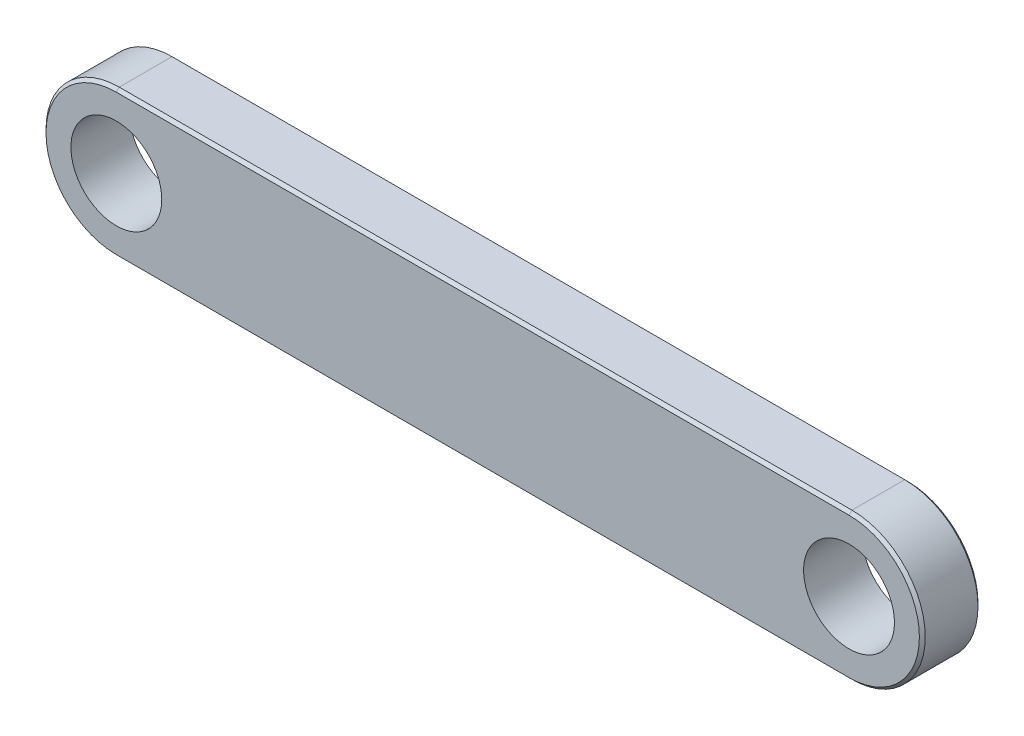
ISO-10303-21;
HEADER;
FILE_DESCRIPTION(('STEP AP214'),'2;1');
FILE_NAME('part.step','',(''),(''),'','','');
FILE_SCHEMA(('AUTOMOTIVE_DESIGN { 1 0 10303 214 1 1 1 1 }'));
ENDSEC;
DATA;
#1=APPLICATION_CONTEXT('core data for automotive mechanical design processes');
#2=APPLICATION_PROTOCOL_DEFINITION('international standard','automotive_design',2000,#1);
#3=PRODUCT_CONTEXT('',#1,'mechanical');
#4=PRODUCT('Part','Part','',(#3));
#5=PRODUCT_RELATED_PRODUCT_CATEGORY('part','',(#4));
#6=PRODUCT_DEFINITION_FORMATION('','',#4);
#7=PRODUCT_DEFINITION_CONTEXT('part definition',#1,'design');
#8=PRODUCT_DEFINITION('design','',#6,#7);
#9=PRODUCT_DEFINITION_SHAPE('','',#8);
#10=(LENGTH_UNIT() NAMED_UNIT(*) SI_UNIT(.MILLI.,.METRE.));
#11=(NAMED_UNIT(*) PLANE_ANGLE_UNIT() SI_UNIT($,.RADIAN.));
#12=(NAMED_UNIT(*) SI_UNIT($,.STERADIAN.) SOLID_ANGLE_UNIT());
#13=UNCERTAINTY_MEASURE_WITH_UNIT(LENGTH_MEASURE(1.E-05),#10,'distance_accuracy_value','');
#14=(GEOMETRIC_REPRESENTATION_CONTEXT(3) GLOBAL_UNCERTAINTY_ASSIGNED_CONTEXT((#13)) GLOBAL_UNIT_ASSIGNED_CONTEXT((#10,
#11,#12)) REPRESENTATION_CONTEXT('',''));
#15=CARTESIAN_POINT('',(0.,0.,0.));
#16=DIRECTION('',(0.,0.,1.));
#17=DIRECTION('',(1.,0.,0.));
#18=AXIS2_PLACEMENT_3D('',#15,#16,#17);
#19=CARTESIAN_POINT('',(-12.5,0.,2.));
#20=DIRECTION('',(0.,0.,1.));
#21=DIRECTION('',(1.,0.,0.));
#22=AXIS2_PLACEMENT_3D('',#19,#20,#21);
#23=PLANE('',#22);
#24=CARTESIAN_POINT('',(-12.5,0.,2.));
#25=DIRECTION('',(0.,0.,1.));
#26=DIRECTION('',(1.,0.,0.));
#27=AXIS2_PLACEMENT_3D('',#24,#25,#26);
#28=CIRCLE('',#27,2.4);
#29=CARTESIAN_POINT('',(-12.5,2.4,2.));
#30=VERTEX_POINT('',#29);
#31=CARTESIAN_POINT('',(-12.5,-2.4,2.));
#32=VERTEX_POINT('',#31);
#33=EDGE_CURVE('E45',#30,#32,#28,.T.);
#34=ORIENTED_EDGE('',*,*,#33,.T.);
#35=DIRECTION('',(1.,0.,0.));
#36=VECTOR('',#35,1.);
#37=CARTESIAN_POINT('',(12.5,-2.4,2.));
#38=LINE('',#37,#36);
#39=CARTESIAN_POINT('',(12.5,-2.4,2.));
#40=VERTEX_POINT('',#39);
#41=EDGE_CURVE('E11',#32,#40,#38,.T.);
#42=ORIENTED_EDGE('',*,*,#41,.T.);
#43=CARTESIAN_POINT('',(12.5,0.,2.));
#44=DIRECTION('',(0.,0.,1.));
#45=DIRECTION('',(1.,0.,0.));
#46=AXIS2_PLACEMENT_3D('',#43,#44,#45);
#47=CIRCLE('',#46,2.4);
#48=CARTESIAN_POINT('',(12.5,2.40000000000001,2.));
#49=VERTEX_POINT('',#48);
#50=EDGE_CURVE('E162',#40,#49,#47,.T.);
#51=ORIENTED_EDGE('',*,*,#50,.T.);
#52=DIRECTION('',(-1.,0.,0.));
#53=VECTOR('',#52,1.);
#54=CARTESIAN_POINT('',(-12.5,2.4,2.));
#55=LINE('',#54,#53);
#56=EDGE_CURVE('E132',#49,#30,#55,.T.);
#57=ORIENTED_EDGE('',*,*,#56,.T.);
#58=EDGE_LOOP('',(#34,#42,#51,#57));
#59=FACE_BOUND('',#58,.T.);
#60=CARTESIAN_POINT('',(-12.5,0.,2.));
#61=DIRECTION('',(0.,0.,1.));
#62=DIRECTION('',(1.,0.,0.));
#63=AXIS2_PLACEMENT_3D('',#60,#61,#62);
#64=CIRCLE('',#63,1.55);
#65=CARTESIAN_POINT('',(-10.95,0.,2.));
#66=VERTEX_POINT('',#65);
#67=EDGE_CURVE('E210',#66,#66,#64,.T.);
#68=ORIENTED_EDGE('',*,*,#67,.F.);
#69=EDGE_LOOP('',(#68));
#70=FACE_BOUND('',#69,.T.);
#71=CARTESIAN_POINT('',(12.5,0.,2.));
#72=DIRECTION('',(0.,0.,1.));
#73=DIRECTION('',(1.,0.,0.));
#74=AXIS2_PLACEMENT_3D('',#71,#72,#73);
#75=CIRCLE('',#74,1.55);
#76=CARTESIAN_POINT('',(14.05,0.,2.));
#77=VERTEX_POINT('',#76);
#78=EDGE_CURVE('E214',#77,#77,#75,.T.);
#79=ORIENTED_EDGE('',*,*,#78,.F.);
#80=EDGE_LOOP('',(#79));
#81=FACE_BOUND('',#80,.T.);
#82=ADVANCED_FACE('F35',(#59,#70,#81),#23,.T.);
#83=CARTESIAN_POINT('',(-12.5,0.,0.));
#84=DIRECTION('',(0.,0.,1.));
#85=DIRECTION('',(1.,0.,0.));
#86=AXIS2_PLACEMENT_3D('',#83,#84,#85);
#87=PLANE('',#86);
#88=DIRECTION('',(1.,0.,0.));
#89=VECTOR('',#88,1.);
#90=CARTESIAN_POINT('',(-12.5,2.4,0.));
#91=LINE('',#90,#89);
#92=CARTESIAN_POINT('',(-12.5,2.4,0.));
#93=VERTEX_POINT('',#92);
#94=CARTESIAN_POINT('',(12.5,2.40000000000001,0.));
#95=VERTEX_POINT('',#94);
#96=EDGE_CURVE('E138',#93,#95,#91,.T.);
#97=ORIENTED_EDGE('',*,*,#96,.T.);
#98=CARTESIAN_POINT('',(12.5,0.,0.));
#99=DIRECTION('',(0.,0.,1.));
#100=DIRECTION('',(1.,0.,0.));
#101=AXIS2_PLACEMENT_3D('',#98,#99,#100);
#102=CIRCLE('',#101,2.4);
#103=CARTESIAN_POINT('',(12.5,-2.4,0.));
#104=VERTEX_POINT('',#103);
#105=EDGE_CURVE('E149',#95,#104,#102,.F.);
#106=ORIENTED_EDGE('',*,*,#105,.T.);
#107=DIRECTION('',(-1.,0.,0.));
#108=VECTOR('',#107,1.);
#109=CARTESIAN_POINT('',(-12.5,-2.4,0.));
#110=LINE('',#109,#108);
#111=CARTESIAN_POINT('',(-12.5,-2.4,0.));
#112=VERTEX_POINT('',#111);
#113=EDGE_CURVE('E147',#104,#112,#110,.T.);
#114=ORIENTED_EDGE('',*,*,#113,.T.);
#115=CARTESIAN_POINT('',(-12.5,0.,0.));
#116=DIRECTION('',(0.,0.,1.));
#117=DIRECTION('',(1.,0.,0.));
#118=AXIS2_PLACEMENT_3D('',#115,#116,#117);
#119=CIRCLE('',#118,2.4);
#120=EDGE_CURVE('E145',#112,#93,#119,.F.);
#121=ORIENTED_EDGE('',*,*,#120,.T.);
#122=EDGE_LOOP('',(#97,#106,#114,#121));
#123=FACE_BOUND('',#122,.T.);
#124=CARTESIAN_POINT('',(-12.5,0.,0.));
#125=DIRECTION('',(0.,0.,1.));
#126=DIRECTION('',(1.,0.,0.));
#127=AXIS2_PLACEMENT_3D('',#124,#125,#126);
#128=CIRCLE('',#127,1.55);
#129=CARTESIAN_POINT('',(-10.95,0.,0.));
#130=VERTEX_POINT('',#129);
#131=EDGE_CURVE('E211',#130,#130,#128,.T.);
#132=ORIENTED_EDGE('',*,*,#131,.T.);
#133=EDGE_LOOP('',(#132));
#134=FACE_BOUND('',#133,.T.);
#135=CARTESIAN_POINT('',(12.5,0.,0.));
#136=DIRECTION('',(0.,0.,1.));
#137=DIRECTION('',(1.,0.,0.));
#138=AXIS2_PLACEMENT_3D('',#135,#136,#137);
#139=CIRCLE('',#138,1.55);
#140=CARTESIAN_POINT('',(14.05,0.,0.));
#141=VERTEX_POINT('',#140);
#142=EDGE_CURVE('E175',#141,#141,#139,.T.);
#143=ORIENTED_EDGE('',*,*,#142,.T.);
#144=EDGE_LOOP('',(#143));
#145=FACE_BOUND('',#144,.T.);
#146=ADVANCED_FACE('F200',(#123,#134,#145),#87,.F.);
#147=CARTESIAN_POINT('',(-12.5,0.,2.));
#148=DIRECTION('',(0.,0.,-1.));
#149=DIRECTION('',(-1.,0.,0.));
#150=AXIS2_PLACEMENT_3D('',#147,#148,#149);
#151=CYLINDRICAL_SURFACE('',#150,2.5);
#152=DIRECTION('',(0.,0.,-1.));
#153=VECTOR('',#152,1.);
#154=CARTESIAN_POINT('',(-12.5,2.5,2.));
#155=LINE('',#154,#153);
#156=CARTESIAN_POINT('',(-12.5,2.5,1.9));
#157=VERTEX_POINT('',#156);
#158=CARTESIAN_POINT('',(-12.5,2.5,0.0999999999999994));
#159=VERTEX_POINT('',#158);
#160=EDGE_CURVE('E110',#157,#159,#155,.T.);
#161=ORIENTED_EDGE('',*,*,#160,.T.);
#162=CARTESIAN_POINT('',(-12.5,0.,0.0999999999999994));
#163=DIRECTION('',(0.,0.,1.));
#164=DIRECTION('',(1.,0.,0.));
#165=AXIS2_PLACEMENT_3D('',#162,#163,#164);
#166=CIRCLE('',#165,2.5);
#167=CARTESIAN_POINT('',(-12.5,-2.5,0.0999999999999994));
#168=VERTEX_POINT('',#167);
#169=EDGE_CURVE('E116',#159,#168,#166,.T.);
#170=ORIENTED_EDGE('',*,*,#169,.T.);
#171=DIRECTION('',(0.,0.,-1.));
#172=VECTOR('',#171,1.);
#173=CARTESIAN_POINT('',(-12.5,-2.5,2.));
#174=LINE('',#173,#172);
#175=CARTESIAN_POINT('',(-12.5,-2.5,1.9));
#176=VERTEX_POINT('',#175);
#177=EDGE_CURVE('E136',#176,#168,#174,.T.);
#178=ORIENTED_EDGE('',*,*,#177,.F.);
#179=CARTESIAN_POINT('',(-12.5,0.,1.9));
#180=DIRECTION('',(0.,0.,1.));
#181=DIRECTION('',(1.,0.,0.));
#182=AXIS2_PLACEMENT_3D('',#179,#180,#181);
#183=CIRCLE('',#182,2.5);
#184=EDGE_CURVE('E157',#176,#157,#183,.F.);
#185=ORIENTED_EDGE('',*,*,#184,.T.);
#186=EDGE_LOOP('',(#161,#170,#178,#185));
#187=FACE_BOUND('',#186,.T.);
#188=ADVANCED_FACE('F186',(#187),#151,.T.);
#189=CARTESIAN_POINT('',(-12.5,-2.5,2.));
#190=DIRECTION('',(0.,1.,0.));
#191=DIRECTION('',(-1.,0.,0.));
#192=AXIS2_PLACEMENT_3D('',#189,#190,#191);
#193=PLANE('',#192);
#194=ORIENTED_EDGE('',*,*,#177,.T.);
#195=DIRECTION('',(1.,0.,0.));
#196=VECTOR('',#195,1.);
#197=CARTESIAN_POINT('',(-12.5,-2.5,0.0999999999999994));
#198=LINE('',#197,#196);
#199=CARTESIAN_POINT('',(12.5,-2.5,0.0999999999999994));
#200=VERTEX_POINT('',#199);
#201=EDGE_CURVE('E155',#168,#200,#198,.T.);
#202=ORIENTED_EDGE('',*,*,#201,.T.);
#203=DIRECTION('',(0.,0.,-1.));
#204=VECTOR('',#203,1.);
#205=CARTESIAN_POINT('',(12.5,-2.5,2.));
#206=LINE('',#205,#204);
#207=CARTESIAN_POINT('',(12.5,-2.5,1.9));
#208=VERTEX_POINT('',#207);
#209=EDGE_CURVE('E127',#208,#200,#206,.T.);
#210=ORIENTED_EDGE('',*,*,#209,.F.);
#211=DIRECTION('',(-1.,0.,0.));
#212=VECTOR('',#211,1.);
#213=CARTESIAN_POINT('',(-12.5,-2.5,1.9));
#214=LINE('',#213,#212);
#215=EDGE_CURVE('E152',#208,#176,#214,.T.);
#216=ORIENTED_EDGE('',*,*,#215,.T.);
#217=EDGE_LOOP('',(#194,#202,#210,#216));
#218=FACE_BOUND('',#217,.T.);
#219=ADVANCED_FACE('F184',(#218),#193,.F.);
#220=CARTESIAN_POINT('',(12.5,0.,2.));
#221=DIRECTION('',(0.,0.,-1.));
#222=DIRECTION('',(-1.,0.,0.));
#223=AXIS2_PLACEMENT_3D('',#220,#221,#222);
#224=CYLINDRICAL_SURFACE('',#223,2.5);
#225=ORIENTED_EDGE('',*,*,#209,.T.);
#226=CARTESIAN_POINT('',(12.5,0.,0.0999999999999994));
#227=DIRECTION('',(0.,0.,1.));
#228=DIRECTION('',(1.,0.,0.));
#229=AXIS2_PLACEMENT_3D('',#226,#227,#228);
#230=CIRCLE('',#229,2.5);
#231=CARTESIAN_POINT('',(12.5,2.5,0.0999999999999994));
#232=VERTEX_POINT('',#231);
#233=EDGE_CURVE('E126',#200,#232,#230,.T.);
#234=ORIENTED_EDGE('',*,*,#233,.T.);
#235=DIRECTION('',(0.,0.,-1.));
#236=VECTOR('',#235,1.);
#237=CARTESIAN_POINT('',(12.5,2.5,2.));
#238=LINE('',#237,#236);
#239=CARTESIAN_POINT('',(12.5,2.5,1.9));
#240=VERTEX_POINT('',#239);
#241=EDGE_CURVE('E108',#240,#232,#238,.T.);
#242=ORIENTED_EDGE('',*,*,#241,.F.);
#243=CARTESIAN_POINT('',(12.5,0.,1.9));
#244=DIRECTION('',(0.,0.,1.));
#245=DIRECTION('',(1.,0.,0.));
#246=AXIS2_PLACEMENT_3D('',#243,#244,#245);
#247=CIRCLE('',#246,2.5);
#248=EDGE_CURVE('E123',#240,#208,#247,.F.);
#249=ORIENTED_EDGE('',*,*,#248,.T.);
#250=EDGE_LOOP('',(#225,#234,#242,#249));
#251=FACE_BOUND('',#250,.T.);
#252=ADVANCED_FACE('F121',(#251),#224,.T.);
#253=CARTESIAN_POINT('',(-12.5,2.5,2.));
#254=DIRECTION('',(0.,-1.,0.));
#255=DIRECTION('',(1.,0.,0.));
#256=AXIS2_PLACEMENT_3D('',#253,#254,#255);
#257=PLANE('',#256);
#258=ORIENTED_EDGE('',*,*,#241,.T.);
#259=DIRECTION('',(-1.,0.,0.));
#260=VECTOR('',#259,1.);
#261=CARTESIAN_POINT('',(-12.5,2.5,0.0999999999999994));
#262=LINE('',#261,#260);
#263=EDGE_CURVE('E115',#232,#159,#262,.T.);
#264=ORIENTED_EDGE('',*,*,#263,.T.);
#265=ORIENTED_EDGE('',*,*,#160,.F.);
#266=DIRECTION('',(1.,0.,0.));
#267=VECTOR('',#266,1.);
#268=CARTESIAN_POINT('',(12.5,2.5,1.9));
#269=LINE('',#268,#267);
#270=EDGE_CURVE('E105',#157,#240,#269,.T.);
#271=ORIENTED_EDGE('',*,*,#270,.T.);
#272=EDGE_LOOP('',(#258,#264,#265,#271));
#273=FACE_BOUND('',#272,.T.);
#274=ADVANCED_FACE('F107',(#273),#257,.F.);
#275=CARTESIAN_POINT('',(-12.5,0.,2.));
#276=DIRECTION('',(0.,0.,-1.));
#277=DIRECTION('',(-1.,0.,0.));
#278=AXIS2_PLACEMENT_3D('',#275,#276,#277);
#279=CYLINDRICAL_SURFACE('',#278,1.55);
#280=ORIENTED_EDGE('',*,*,#67,.T.);
#281=EDGE_LOOP('',(#280));
#282=FACE_BOUND('',#281,.T.);
#283=ORIENTED_EDGE('',*,*,#131,.F.);
#284=EDGE_LOOP('',(#283));
#285=FACE_BOUND('',#284,.T.);
#286=ADVANCED_FACE('F233',(#282,#285),#279,.F.);
#287=CARTESIAN_POINT('',(12.5,0.,2.));
#288=DIRECTION('',(0.,0.,-1.));
#289=DIRECTION('',(-1.,0.,0.));
#290=AXIS2_PLACEMENT_3D('',#287,#288,#289);
#291=CYLINDRICAL_SURFACE('',#290,1.55);
#292=ORIENTED_EDGE('',*,*,#78,.T.);
#293=EDGE_LOOP('',(#292));
#294=FACE_BOUND('',#293,.T.);
#295=ORIENTED_EDGE('',*,*,#142,.F.);
#296=EDGE_LOOP('',(#295));
#297=FACE_BOUND('',#296,.T.);
#298=ADVANCED_FACE('F222',(#294,#297),#291,.F.);
#299=CARTESIAN_POINT('',(-12.5,0.,0.0999999999999994));
#300=DIRECTION('',(0.,0.,1.));
#301=DIRECTION('',(1.,0.,0.));
#302=AXIS2_PLACEMENT_3D('',#299,#300,#301);
#303=CONICAL_SURFACE('',#302,2.5,0.785398163397431);
#304=DIRECTION('',(0.,0.707106781186535,0.70710678118656));
#305=VECTOR('',#304,1.);
#306=CARTESIAN_POINT('',(-12.5,2.4,0.));
#307=LINE('',#306,#305);
#308=EDGE_CURVE('E169',#93,#159,#307,.T.);
#309=ORIENTED_EDGE('',*,*,#308,.F.);
#310=ORIENTED_EDGE('',*,*,#120,.F.);
#311=DIRECTION('',(0.,0.707106781186535,-0.70710678118656));
#312=VECTOR('',#311,1.);
#313=CARTESIAN_POINT('',(-12.5,-2.5,0.0999999999999994));
#314=LINE('',#313,#312);
#315=EDGE_CURVE('E172',#168,#112,#314,.T.);
#316=ORIENTED_EDGE('',*,*,#315,.F.);
#317=ORIENTED_EDGE('',*,*,#169,.F.);
#318=EDGE_LOOP('',(#309,#310,#316,#317));
#319=FACE_BOUND('',#318,.T.);
#320=ADVANCED_FACE('F190',(#319),#303,.T.);
#321=CARTESIAN_POINT('',(-12.5,-2.5,0.0999999999999994));
#322=DIRECTION('',(0.,0.70710678118656,0.707106781186535));
#323=DIRECTION('',(1.,0.,0.));
#324=AXIS2_PLACEMENT_3D('',#321,#322,#323);
#325=PLANE('',#324);
#326=ORIENTED_EDGE('',*,*,#315,.T.);
#327=ORIENTED_EDGE('',*,*,#113,.F.);
#328=DIRECTION('',(0.,0.707106781186535,-0.70710678118656));
#329=VECTOR('',#328,1.);
#330=CARTESIAN_POINT('',(12.5,-2.5,0.0999999999999994));
#331=LINE('',#330,#329);
#332=EDGE_CURVE('E167',#200,#104,#331,.T.);
#333=ORIENTED_EDGE('',*,*,#332,.F.);
#334=ORIENTED_EDGE('',*,*,#201,.F.);
#335=EDGE_LOOP('',(#326,#327,#333,#334));
#336=FACE_BOUND('',#335,.T.);
#337=ADVANCED_FACE('F207',(#336),#325,.F.);
#338=CARTESIAN_POINT('',(-12.5,2.5,0.0999999999999994));
#339=DIRECTION('',(0.,-0.70710678118656,0.707106781186535));
#340=DIRECTION('',(-1.,0.,0.));
#341=AXIS2_PLACEMENT_3D('',#338,#339,#340);
#342=PLANE('',#341);
#343=ORIENTED_EDGE('',*,*,#308,.T.);
#344=ORIENTED_EDGE('',*,*,#263,.F.);
#345=DIRECTION('',(0.,0.707106781186535,0.70710678118656));
#346=VECTOR('',#345,1.);
#347=CARTESIAN_POINT('',(12.5,2.40000000000001,0.));
#348=LINE('',#347,#346);
#349=EDGE_CURVE('E165',#95,#232,#348,.T.);
#350=ORIENTED_EDGE('',*,*,#349,.F.);
#351=ORIENTED_EDGE('',*,*,#96,.F.);
#352=EDGE_LOOP('',(#343,#344,#350,#351));
#353=FACE_BOUND('',#352,.T.);
#354=ADVANCED_FACE('F196',(#353),#342,.F.);
#355=CARTESIAN_POINT('',(12.5,0.,0.0999999999999994));
#356=DIRECTION('',(0.,0.,1.));
#357=DIRECTION('',(1.,0.,0.));
#358=AXIS2_PLACEMENT_3D('',#355,#356,#357);
#359=CONICAL_SURFACE('',#358,2.5,0.785398163397431);
#360=ORIENTED_EDGE('',*,*,#332,.T.);
#361=ORIENTED_EDGE('',*,*,#105,.F.);
#362=ORIENTED_EDGE('',*,*,#349,.T.);
#363=ORIENTED_EDGE('',*,*,#233,.F.);
#364=EDGE_LOOP('',(#360,#361,#362,#363));
#365=FACE_BOUND('',#364,.T.);
#366=ADVANCED_FACE('F203',(#365),#359,.T.);
#367=CARTESIAN_POINT('',(-12.5,2.4,2.));
#368=DIRECTION('',(0.,0.707106781186548,0.707106781186548));
#369=DIRECTION('',(1.,0.,0.));
#370=AXIS2_PLACEMENT_3D('',#367,#368,#369);
#371=PLANE('',#370);
#372=DIRECTION('',(0.,-0.707106781186548,0.707106781186548));
#373=VECTOR('',#372,1.);
#374=CARTESIAN_POINT('',(12.5,2.5,1.9));
#375=LINE('',#374,#373);
#376=EDGE_CURVE('E131',#240,#49,#375,.T.);
#377=ORIENTED_EDGE('',*,*,#376,.F.);
#378=ORIENTED_EDGE('',*,*,#270,.F.);
#379=DIRECTION('',(0.,0.707106781186548,-0.707106781186548));
#380=VECTOR('',#379,1.);
#381=CARTESIAN_POINT('',(-12.5,2.4,2.));
#382=LINE('',#381,#380);
#383=EDGE_CURVE('E40',#30,#157,#382,.T.);
#384=ORIENTED_EDGE('',*,*,#383,.F.);
#385=ORIENTED_EDGE('',*,*,#56,.F.);
#386=EDGE_LOOP('',(#377,#378,#384,#385));
#387=FACE_BOUND('',#386,.T.);
#388=ADVANCED_FACE('F38',(#387),#371,.T.);
#389=CARTESIAN_POINT('',(-12.5,0.,2.));
#390=DIRECTION('',(0.,0.,-1.));
#391=DIRECTION('',(-1.,0.,0.));
#392=AXIS2_PLACEMENT_3D('',#389,#390,#391);
#393=CONICAL_SURFACE('',#392,2.4,0.785398163397448);
#394=ORIENTED_EDGE('',*,*,#383,.T.);
#395=ORIENTED_EDGE('',*,*,#184,.F.);
#396=DIRECTION('',(0.,-0.707106781186548,-0.707106781186548));
#397=VECTOR('',#396,1.);
#398=CARTESIAN_POINT('',(-12.5,-2.4,2.));
#399=LINE('',#398,#397);
#400=EDGE_CURVE('E134',#32,#176,#399,.T.);
#401=ORIENTED_EDGE('',*,*,#400,.F.);
#402=ORIENTED_EDGE('',*,*,#33,.F.);
#403=EDGE_LOOP('',(#394,#395,#401,#402));
#404=FACE_BOUND('',#403,.T.);
#405=ADVANCED_FACE('F180',(#404),#393,.T.);
#406=CARTESIAN_POINT('',(12.5,0.,2.));
#407=DIRECTION('',(0.,0.,-1.));
#408=DIRECTION('',(-1.,0.,0.));
#409=AXIS2_PLACEMENT_3D('',#406,#407,#408);
#410=CONICAL_SURFACE('',#409,2.4,0.785398163397448);
#411=ORIENTED_EDGE('',*,*,#376,.T.);
#412=ORIENTED_EDGE('',*,*,#50,.F.);
#413=DIRECTION('',(0.,0.707106781186548,0.707106781186548));
#414=VECTOR('',#413,1.);
#415=CARTESIAN_POINT('',(12.5,-2.5,1.9));
#416=LINE('',#415,#414);
#417=EDGE_CURVE('E59',#208,#40,#416,.T.);
#418=ORIENTED_EDGE('',*,*,#417,.F.);
#419=ORIENTED_EDGE('',*,*,#248,.F.);
#420=EDGE_LOOP('',(#411,#412,#418,#419));
#421=FACE_BOUND('',#420,.T.);
#422=ADVANCED_FACE('F135',(#421),#410,.T.);
#423=CARTESIAN_POINT('',(-12.5,-2.4,2.));
#424=DIRECTION('',(0.,-0.707106781186548,0.707106781186548));
#425=DIRECTION('',(-1.,0.,0.));
#426=AXIS2_PLACEMENT_3D('',#423,#424,#425);
#427=PLANE('',#426);
#428=ORIENTED_EDGE('',*,*,#400,.T.);
#429=ORIENTED_EDGE('',*,*,#215,.F.);
#430=ORIENTED_EDGE('',*,*,#417,.T.);
#431=ORIENTED_EDGE('',*,*,#41,.F.);
#432=EDGE_LOOP('',(#428,#429,#430,#431));
#433=FACE_BOUND('',#432,.T.);
#434=ADVANCED_FACE('F178',(#433),#427,.T.);
#435=CLOSED_SHELL('',(#82,#146,#188,#219,#252,#274,#286,#298,#320,#337,#354,#366,#388,#405,#422,#434));
#436=MANIFOLD_SOLID_BREP('B2',#435);
#437=ADVANCED_BREP_SHAPE_REPRESENTATION('',(#18,#436),#14);
#438=SHAPE_DEFINITION_REPRESENTATION(#9,#437);
ENDSEC;
END-ISO-10303-21;
